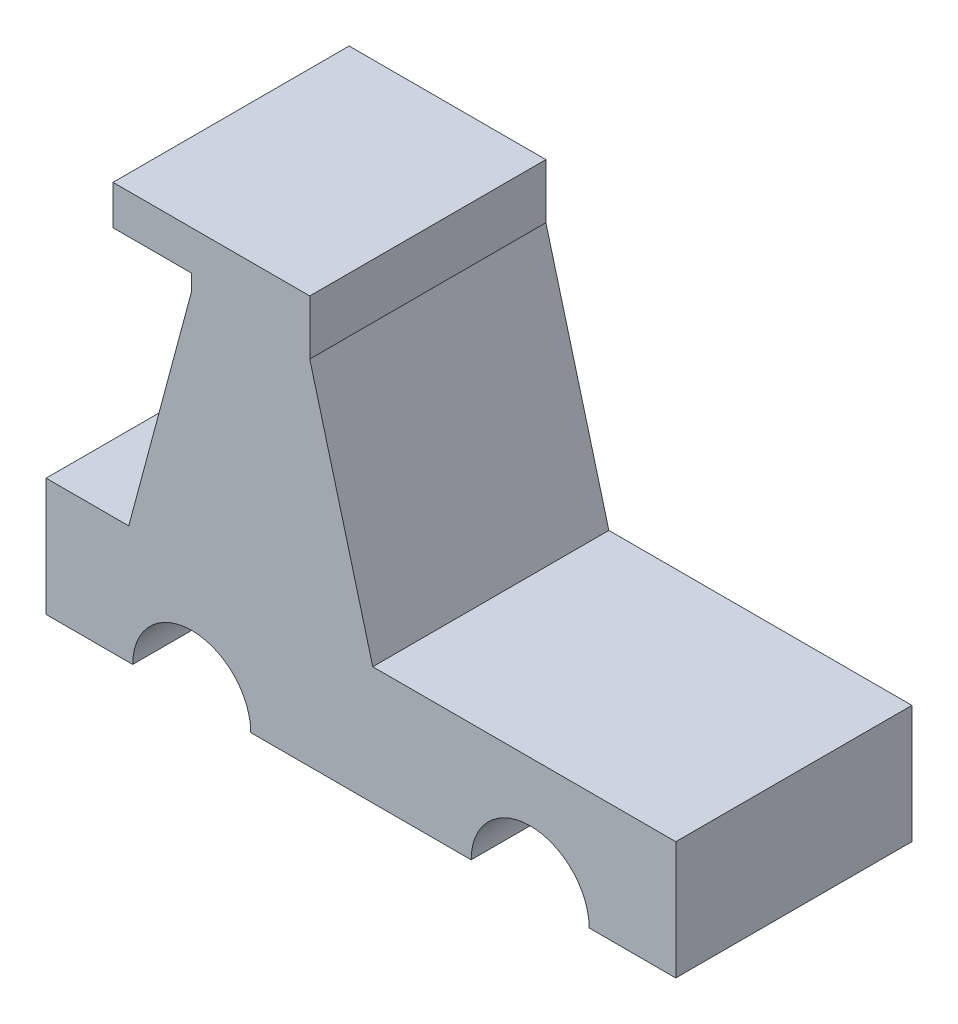
ISO-10303-21;
HEADER;
FILE_DESCRIPTION(('STEP AP214'),'2;1');
FILE_NAME('part.step','',(''),(''),'','','');
FILE_SCHEMA(('AUTOMOTIVE_DESIGN { 1 0 10303 214 1 1 1 1 }'));
ENDSEC;
DATA;
#1=APPLICATION_CONTEXT('core data for automotive mechanical design processes');
#2=APPLICATION_PROTOCOL_DEFINITION('international standard','automotive_design',2000,#1);
#3=PRODUCT_CONTEXT('',#1,'mechanical');
#4=PRODUCT('Part','Part','',(#3));
#5=PRODUCT_RELATED_PRODUCT_CATEGORY('part','',(#4));
#6=PRODUCT_DEFINITION_FORMATION('','',#4);
#7=PRODUCT_DEFINITION_CONTEXT('part definition',#1,'design');
#8=PRODUCT_DEFINITION('design','',#6,#7);
#9=PRODUCT_DEFINITION_SHAPE('','',#8);
#10=(LENGTH_UNIT() NAMED_UNIT(*) SI_UNIT(.MILLI.,.METRE.));
#11=(NAMED_UNIT(*) PLANE_ANGLE_UNIT() SI_UNIT($,.RADIAN.));
#12=(NAMED_UNIT(*) SI_UNIT($,.STERADIAN.) SOLID_ANGLE_UNIT());
#13=UNCERTAINTY_MEASURE_WITH_UNIT(LENGTH_MEASURE(1.E-05),#10,'distance_accuracy_value','');
#14=(GEOMETRIC_REPRESENTATION_CONTEXT(3) GLOBAL_UNCERTAINTY_ASSIGNED_CONTEXT((#13)) GLOBAL_UNIT_ASSIGNED_CONTEXT((#10,
#11,#12)) REPRESENTATION_CONTEXT('',''));
#15=CARTESIAN_POINT('',(0.,0.,0.));
#16=DIRECTION('',(0.,0.,1.));
#17=DIRECTION('',(1.,0.,0.));
#18=AXIS2_PLACEMENT_3D('',#15,#16,#17);
#19=CARTESIAN_POINT('',(0.,30.,0.));
#20=DIRECTION('',(0.,-1.,0.));
#21=DIRECTION('',(0.,0.,-1.));
#22=AXIS2_PLACEMENT_3D('',#19,#20,#21);
#23=PLANE('',#22);
#24=DIRECTION('',(0.,0.,1.));
#25=VECTOR('',#24,1.);
#26=CARTESIAN_POINT('',(10.5,30.,-79.4291412023312));
#27=LINE('',#26,#25);
#28=CARTESIAN_POINT('',(10.5,30.,-30.));
#29=VERTEX_POINT('',#28);
#30=CARTESIAN_POINT('',(10.5,30.,0.));
#31=VERTEX_POINT('',#30);
#32=EDGE_CURVE('E210',#29,#31,#27,.T.);
#33=ORIENTED_EDGE('',*,*,#32,.F.);
#34=DIRECTION('',(-1.,0.,0.));
#35=VECTOR('',#34,1.);
#36=CARTESIAN_POINT('',(0.,30.,-30.));
#37=LINE('',#36,#35);
#38=CARTESIAN_POINT('',(0.,30.,-30.));
#39=VERTEX_POINT('',#38);
#40=EDGE_CURVE('E202',#29,#39,#37,.T.);
#41=ORIENTED_EDGE('',*,*,#40,.T.);
#42=DIRECTION('',(0.,0.,1.));
#43=VECTOR('',#42,1.);
#44=CARTESIAN_POINT('',(0.,30.,0.));
#45=LINE('',#44,#43);
#46=CARTESIAN_POINT('',(0.,30.,0.));
#47=VERTEX_POINT('',#46);
#48=EDGE_CURVE('E190',#39,#47,#45,.T.);
#49=ORIENTED_EDGE('',*,*,#48,.T.);
#50=DIRECTION('',(1.,0.,0.));
#51=VECTOR('',#50,1.);
#52=CARTESIAN_POINT('',(0.,30.,0.));
#53=LINE('',#52,#51);
#54=EDGE_CURVE('E199',#47,#31,#53,.T.);
#55=ORIENTED_EDGE('',*,*,#54,.T.);
#56=EDGE_LOOP('',(#33,#41,#49,#55));
#57=FACE_BOUND('',#56,.T.);
#58=ADVANCED_FACE('F36',(#57),#23,.F.);
#59=CARTESIAN_POINT('',(0.,30.,0.));
#60=DIRECTION('',(1.,0.,0.));
#61=DIRECTION('',(0.,0.,-1.));
#62=AXIS2_PLACEMENT_3D('',#59,#60,#61);
#63=PLANE('',#62);
#64=DIRECTION('',(0.,-1.,0.));
#65=VECTOR('',#64,1.);
#66=CARTESIAN_POINT('',(0.,30.,-30.));
#67=LINE('',#66,#65);
#68=CARTESIAN_POINT('',(0.,15.,-30.));
#69=VERTEX_POINT('',#68);
#70=EDGE_CURVE('E171',#39,#69,#67,.T.);
#71=ORIENTED_EDGE('',*,*,#70,.T.);
#72=DIRECTION('',(0.,0.,1.));
#73=VECTOR('',#72,1.);
#74=CARTESIAN_POINT('',(0.,15.,0.));
#75=LINE('',#74,#73);
#76=CARTESIAN_POINT('',(0.,15.,0.));
#77=VERTEX_POINT('',#76);
#78=EDGE_CURVE('E215',#69,#77,#75,.T.);
#79=ORIENTED_EDGE('',*,*,#78,.T.);
#80=DIRECTION('',(0.,-1.,0.));
#81=VECTOR('',#80,1.);
#82=CARTESIAN_POINT('',(0.,30.,0.));
#83=LINE('',#82,#81);
#84=EDGE_CURVE('E173',#47,#77,#83,.T.);
#85=ORIENTED_EDGE('',*,*,#84,.F.);
#86=ORIENTED_EDGE('',*,*,#48,.F.);
#87=EDGE_LOOP('',(#71,#79,#85,#86));
#88=FACE_BOUND('',#87,.T.);
#89=ADVANCED_FACE('F38',(#88),#63,.F.);
#90=CARTESIAN_POINT('',(0.,30.,0.));
#91=DIRECTION('',(0.,0.,-1.));
#92=DIRECTION('',(-1.,0.,0.));
#93=AXIS2_PLACEMENT_3D('',#90,#91,#92);
#94=PLANE('',#93);
#95=ORIENTED_EDGE('',*,*,#84,.T.);
#96=DIRECTION('',(1.,0.,0.));
#97=VECTOR('',#96,1.);
#98=CARTESIAN_POINT('',(0.,15.,0.));
#99=LINE('',#98,#97);
#100=CARTESIAN_POINT('',(11.,15.,0.));
#101=VERTEX_POINT('',#100);
#102=EDGE_CURVE('E217',#77,#101,#99,.T.);
#103=ORIENTED_EDGE('',*,*,#102,.T.);
#104=CARTESIAN_POINT('',(18.5,15.,0.));
#105=DIRECTION('',(0.,0.,-1.));
#106=DIRECTION('',(-1.,0.,0.));
#107=AXIS2_PLACEMENT_3D('',#104,#105,#106);
#108=CIRCLE('',#107,7.5);
#109=CARTESIAN_POINT('',(26.,15.,0.));
#110=VERTEX_POINT('',#109);
#111=EDGE_CURVE('E191',#101,#110,#108,.T.);
#112=ORIENTED_EDGE('',*,*,#111,.T.);
#113=CARTESIAN_POINT('',(54.,15.,0.));
#114=VERTEX_POINT('',#113);
#115=EDGE_CURVE('E166',#110,#114,#99,.T.);
#116=ORIENTED_EDGE('',*,*,#115,.T.);
#117=CARTESIAN_POINT('',(61.5,15.,0.));
#118=DIRECTION('',(0.,0.,-1.));
#119=DIRECTION('',(-1.,0.,0.));
#120=AXIS2_PLACEMENT_3D('',#117,#118,#119);
#121=CIRCLE('',#120,7.5);
#122=CARTESIAN_POINT('',(69.,15.,0.));
#123=VERTEX_POINT('',#122);
#124=EDGE_CURVE('E184',#114,#123,#121,.T.);
#125=ORIENTED_EDGE('',*,*,#124,.T.);
#126=CARTESIAN_POINT('',(80.,15.,0.));
#127=VERTEX_POINT('',#126);
#128=EDGE_CURVE('E59',#123,#127,#99,.T.);
#129=ORIENTED_EDGE('',*,*,#128,.T.);
#130=DIRECTION('',(0.,-1.,0.));
#131=VECTOR('',#130,1.);
#132=CARTESIAN_POINT('',(80.,30.,0.));
#133=LINE('',#132,#131);
#134=CARTESIAN_POINT('',(80.,30.,0.));
#135=VERTEX_POINT('',#134);
#136=EDGE_CURVE('E165',#135,#127,#133,.T.);
#137=ORIENTED_EDGE('',*,*,#136,.F.);
#138=CARTESIAN_POINT('',(41.5,30.,0.));
#139=VERTEX_POINT('',#138);
#140=EDGE_CURVE('E194',#139,#135,#53,.T.);
#141=ORIENTED_EDGE('',*,*,#140,.F.);
#142=DIRECTION('',(0.258819045102518,-0.965925826289069,0.));
#143=VECTOR('',#142,1.);
#144=CARTESIAN_POINT('',(46.2200271285271,12.3846189432333,0.));
#145=LINE('',#144,#143);
#146=CARTESIAN_POINT('',(33.5,59.8564064605514,0.));
#147=VERTEX_POINT('',#146);
#148=EDGE_CURVE('E248',#147,#139,#145,.T.);
#149=ORIENTED_EDGE('',*,*,#148,.F.);
#150=DIRECTION('',(0.,-1.,0.));
#151=VECTOR('',#150,1.);
#152=CARTESIAN_POINT('',(33.5000000000001,0.,0.));
#153=LINE('',#152,#151);
#154=CARTESIAN_POINT('',(33.5,66.8,0.));
#155=VERTEX_POINT('',#154);
#156=EDGE_CURVE('E251',#155,#147,#153,.T.);
#157=ORIENTED_EDGE('',*,*,#156,.F.);
#158=DIRECTION('',(1.,0.,0.));
#159=VECTOR('',#158,1.);
#160=CARTESIAN_POINT('',(0.,66.8,0.));
#161=LINE('',#160,#159);
#162=CARTESIAN_POINT('',(8.49999999999999,66.8,0.));
#163=VERTEX_POINT('',#162);
#164=EDGE_CURVE('E254',#163,#155,#161,.T.);
#165=ORIENTED_EDGE('',*,*,#164,.F.);
#166=DIRECTION('',(0.,1.,0.));
#167=VECTOR('',#166,1.);
#168=CARTESIAN_POINT('',(8.50000000000009,0.,0.));
#169=LINE('',#168,#167);
#170=CARTESIAN_POINT('',(8.5,61.8,0.));
#171=VERTEX_POINT('',#170);
#172=EDGE_CURVE('E257',#171,#163,#169,.T.);
#173=ORIENTED_EDGE('',*,*,#172,.F.);
#174=DIRECTION('',(1.,0.,0.));
#175=VECTOR('',#174,1.);
#176=CARTESIAN_POINT('',(0.,61.8,0.));
#177=LINE('',#176,#175);
#178=CARTESIAN_POINT('',(18.5,61.8,0.));
#179=VERTEX_POINT('',#178);
#180=EDGE_CURVE('E233',#171,#179,#177,.T.);
#181=ORIENTED_EDGE('',*,*,#180,.T.);
#182=DIRECTION('',(0.,1.,0.));
#183=VECTOR('',#182,1.);
#184=CARTESIAN_POINT('',(18.5,0.,0.));
#185=LINE('',#184,#183);
#186=CARTESIAN_POINT('',(18.5,59.8564064605514,0.));
#187=VERTEX_POINT('',#186);
#188=EDGE_CURVE('E228',#187,#179,#185,.T.);
#189=ORIENTED_EDGE('',*,*,#188,.F.);
#190=DIRECTION('',(0.258819045102518,0.965925826289069,0.));
#191=VECTOR('',#190,1.);
#192=CARTESIAN_POINT('',(2.29663336986839,-0.615381056766597,0.));
#193=LINE('',#192,#191);
#194=EDGE_CURVE('E222',#31,#187,#193,.T.);
#195=ORIENTED_EDGE('',*,*,#194,.F.);
#196=ORIENTED_EDGE('',*,*,#54,.F.);
#197=EDGE_LOOP('',(#95,#103,#112,#116,#125,#129,#137,#141,#149,#157,#165,#173,#181,#189,#195,#196));
#198=FACE_BOUND('',#197,.T.);
#199=ADVANCED_FACE('F188',(#198),#94,.F.);
#200=CARTESIAN_POINT('',(80.,30.,0.));
#201=DIRECTION('',(-1.,0.,0.));
#202=DIRECTION('',(0.,0.,1.));
#203=AXIS2_PLACEMENT_3D('',#200,#201,#202);
#204=PLANE('',#203);
#205=ORIENTED_EDGE('',*,*,#136,.T.);
#206=DIRECTION('',(0.,0.,-1.));
#207=VECTOR('',#206,1.);
#208=CARTESIAN_POINT('',(80.,15.,0.));
#209=LINE('',#208,#207);
#210=CARTESIAN_POINT('',(80.,15.,-30.));
#211=VERTEX_POINT('',#210);
#212=EDGE_CURVE('E150',#127,#211,#209,.T.);
#213=ORIENTED_EDGE('',*,*,#212,.T.);
#214=DIRECTION('',(0.,-1.,0.));
#215=VECTOR('',#214,1.);
#216=CARTESIAN_POINT('',(80.,30.,-30.));
#217=LINE('',#216,#215);
#218=CARTESIAN_POINT('',(80.,30.,-30.));
#219=VERTEX_POINT('',#218);
#220=EDGE_CURVE('E162',#219,#211,#217,.T.);
#221=ORIENTED_EDGE('',*,*,#220,.F.);
#222=DIRECTION('',(0.,0.,-1.));
#223=VECTOR('',#222,1.);
#224=CARTESIAN_POINT('',(80.,30.,0.));
#225=LINE('',#224,#223);
#226=EDGE_CURVE('E201',#135,#219,#225,.T.);
#227=ORIENTED_EDGE('',*,*,#226,.F.);
#228=EDGE_LOOP('',(#205,#213,#221,#227));
#229=FACE_BOUND('',#228,.T.);
#230=ADVANCED_FACE('F160',(#229),#204,.F.);
#231=CARTESIAN_POINT('',(0.,30.,-30.));
#232=DIRECTION('',(0.,0.,1.));
#233=DIRECTION('',(1.,0.,0.));
#234=AXIS2_PLACEMENT_3D('',#231,#232,#233);
#235=PLANE('',#234);
#236=ORIENTED_EDGE('',*,*,#220,.T.);
#237=DIRECTION('',(-1.,0.,0.));
#238=VECTOR('',#237,1.);
#239=CARTESIAN_POINT('',(-10.0991698411264,15.,-30.));
#240=LINE('',#239,#238);
#241=CARTESIAN_POINT('',(69.,15.,-30.));
#242=VERTEX_POINT('',#241);
#243=EDGE_CURVE('E147',#211,#242,#240,.T.);
#244=ORIENTED_EDGE('',*,*,#243,.T.);
#245=CARTESIAN_POINT('',(61.5,15.,-30.));
#246=DIRECTION('',(0.,0.,1.));
#247=DIRECTION('',(1.,0.,0.));
#248=AXIS2_PLACEMENT_3D('',#245,#246,#247);
#249=CIRCLE('',#248,7.5);
#250=CARTESIAN_POINT('',(54.,15.,-30.));
#251=VERTEX_POINT('',#250);
#252=EDGE_CURVE('E185',#242,#251,#249,.T.);
#253=ORIENTED_EDGE('',*,*,#252,.T.);
#254=CARTESIAN_POINT('',(26.,15.,-30.));
#255=VERTEX_POINT('',#254);
#256=EDGE_CURVE('E155',#251,#255,#240,.T.);
#257=ORIENTED_EDGE('',*,*,#256,.T.);
#258=CARTESIAN_POINT('',(18.5,15.,-30.));
#259=DIRECTION('',(0.,0.,1.));
#260=DIRECTION('',(-1.,0.,0.));
#261=AXIS2_PLACEMENT_3D('',#258,#259,#260);
#262=CIRCLE('',#261,7.5);
#263=CARTESIAN_POINT('',(11.,15.,-30.));
#264=VERTEX_POINT('',#263);
#265=EDGE_CURVE('E237',#255,#264,#262,.T.);
#266=ORIENTED_EDGE('',*,*,#265,.T.);
#267=EDGE_CURVE('E51',#264,#69,#240,.T.);
#268=ORIENTED_EDGE('',*,*,#267,.T.);
#269=ORIENTED_EDGE('',*,*,#70,.F.);
#270=ORIENTED_EDGE('',*,*,#40,.F.);
#271=DIRECTION('',(-0.258819045102518,-0.965925826289069,0.));
#272=VECTOR('',#271,1.);
#273=CARTESIAN_POINT('',(2.2966333698684,-0.615381056766596,-30.));
#274=LINE('',#273,#272);
#275=CARTESIAN_POINT('',(18.5,59.8564064605514,-30.));
#276=VERTEX_POINT('',#275);
#277=EDGE_CURVE('E226',#276,#29,#274,.T.);
#278=ORIENTED_EDGE('',*,*,#277,.F.);
#279=DIRECTION('',(0.,-1.,0.));
#280=VECTOR('',#279,1.);
#281=CARTESIAN_POINT('',(18.5,0.,-30.));
#282=LINE('',#281,#280);
#283=CARTESIAN_POINT('',(18.5,61.8,-30.));
#284=VERTEX_POINT('',#283);
#285=EDGE_CURVE('E240',#284,#276,#282,.T.);
#286=ORIENTED_EDGE('',*,*,#285,.F.);
#287=DIRECTION('',(-1.,0.,0.));
#288=VECTOR('',#287,1.);
#289=CARTESIAN_POINT('',(0.,61.8,-30.));
#290=LINE('',#289,#288);
#291=CARTESIAN_POINT('',(8.5,61.8,-30.));
#292=VERTEX_POINT('',#291);
#293=EDGE_CURVE('E243',#284,#292,#290,.T.);
#294=ORIENTED_EDGE('',*,*,#293,.T.);
#295=DIRECTION('',(0.,-1.,0.));
#296=VECTOR('',#295,1.);
#297=CARTESIAN_POINT('',(8.50000000000009,0.,-30.));
#298=LINE('',#297,#296);
#299=CARTESIAN_POINT('',(8.49999999999999,66.8,-30.));
#300=VERTEX_POINT('',#299);
#301=EDGE_CURVE('E456',#300,#292,#298,.T.);
#302=ORIENTED_EDGE('',*,*,#301,.F.);
#303=DIRECTION('',(-1.,0.,0.));
#304=VECTOR('',#303,1.);
#305=CARTESIAN_POINT('',(0.,66.8,-30.));
#306=LINE('',#305,#304);
#307=CARTESIAN_POINT('',(33.5,66.8,-30.));
#308=VERTEX_POINT('',#307);
#309=EDGE_CURVE('E448',#308,#300,#306,.T.);
#310=ORIENTED_EDGE('',*,*,#309,.F.);
#311=DIRECTION('',(0.,1.,0.));
#312=VECTOR('',#311,1.);
#313=CARTESIAN_POINT('',(33.5000000000001,0.,-30.));
#314=LINE('',#313,#312);
#315=CARTESIAN_POINT('',(33.5,59.8564064605514,-30.));
#316=VERTEX_POINT('',#315);
#317=EDGE_CURVE('E458',#316,#308,#314,.T.);
#318=ORIENTED_EDGE('',*,*,#317,.F.);
#319=DIRECTION('',(-0.258819045102518,0.965925826289069,0.));
#320=VECTOR('',#319,1.);
#321=CARTESIAN_POINT('',(46.2200271285271,12.3846189432333,-30.));
#322=LINE('',#321,#320);
#323=CARTESIAN_POINT('',(41.5,30.,-30.));
#324=VERTEX_POINT('',#323);
#325=EDGE_CURVE('E264',#324,#316,#322,.T.);
#326=ORIENTED_EDGE('',*,*,#325,.F.);
#327=EDGE_CURVE('E170',#219,#324,#37,.T.);
#328=ORIENTED_EDGE('',*,*,#327,.F.);
#329=EDGE_LOOP('',(#236,#244,#253,#257,#266,#268,#269,#270,#278,#286,#294,#302,#310,#318,#326,#328));
#330=FACE_BOUND('',#329,.T.);
#331=ADVANCED_FACE('F168',(#330),#235,.F.);
#332=ORIENTED_EDGE('',*,*,#327,.T.);
#333=DIRECTION('',(0.,0.,1.));
#334=VECTOR('',#333,1.);
#335=CARTESIAN_POINT('',(41.5,30.,-79.4291412023312));
#336=LINE('',#335,#334);
#337=EDGE_CURVE('E227',#324,#139,#336,.T.);
#338=ORIENTED_EDGE('',*,*,#337,.T.);
#339=ORIENTED_EDGE('',*,*,#140,.T.);
#340=ORIENTED_EDGE('',*,*,#226,.T.);
#341=EDGE_LOOP('',(#332,#338,#339,#340));
#342=FACE_BOUND('',#341,.T.);
#343=ADVANCED_FACE('F285',(#342),#23,.F.);
#344=CARTESIAN_POINT('',(18.5,15.,-30.));
#345=DIRECTION('',(0.,0.,1.));
#346=DIRECTION('',(1.,0.,0.));
#347=AXIS2_PLACEMENT_3D('',#344,#345,#346);
#348=CYLINDRICAL_SURFACE('',#347,7.5);
#349=ORIENTED_EDGE('',*,*,#111,.F.);
#350=DIRECTION('',(0.,0.,1.));
#351=VECTOR('',#350,1.);
#352=CARTESIAN_POINT('',(11.,15.,-30.));
#353=LINE('',#352,#351);
#354=EDGE_CURVE('E464',#101,#264,#353,.F.);
#355=ORIENTED_EDGE('',*,*,#354,.T.);
#356=ORIENTED_EDGE('',*,*,#265,.F.);
#357=DIRECTION('',(0.,0.,1.));
#358=VECTOR('',#357,1.);
#359=CARTESIAN_POINT('',(26.,15.,-30.));
#360=LINE('',#359,#358);
#361=EDGE_CURVE('E466',#255,#110,#360,.T.);
#362=ORIENTED_EDGE('',*,*,#361,.T.);
#363=EDGE_LOOP('',(#349,#355,#356,#362));
#364=FACE_BOUND('',#363,.T.);
#365=ADVANCED_FACE('F287',(#364),#348,.F.);
#366=CARTESIAN_POINT('',(61.5,15.,-30.));
#367=DIRECTION('',(0.,0.,1.));
#368=DIRECTION('',(1.,0.,0.));
#369=AXIS2_PLACEMENT_3D('',#366,#367,#368);
#370=CYLINDRICAL_SURFACE('',#369,7.5);
#371=ORIENTED_EDGE('',*,*,#124,.F.);
#372=DIRECTION('',(0.,0.,1.));
#373=VECTOR('',#372,1.);
#374=CARTESIAN_POINT('',(54.,15.,-30.));
#375=LINE('',#374,#373);
#376=EDGE_CURVE('E11',#114,#251,#375,.F.);
#377=ORIENTED_EDGE('',*,*,#376,.T.);
#378=ORIENTED_EDGE('',*,*,#252,.F.);
#379=DIRECTION('',(0.,0.,1.));
#380=VECTOR('',#379,1.);
#381=CARTESIAN_POINT('',(69.,15.,-30.));
#382=LINE('',#381,#380);
#383=EDGE_CURVE('E44',#242,#123,#382,.T.);
#384=ORIENTED_EDGE('',*,*,#383,.T.);
#385=EDGE_LOOP('',(#371,#377,#378,#384));
#386=FACE_BOUND('',#385,.T.);
#387=ADVANCED_FACE('F183',(#386),#370,.F.);
#388=CARTESIAN_POINT('',(2.29663336986839,-0.615381056766597,-79.4291412023312));
#389=DIRECTION('',(0.965925826289069,-0.258819045102518,0.));
#390=DIRECTION('',(0.258819045102518,0.965925826289069,0.));
#391=AXIS2_PLACEMENT_3D('',#388,#389,#390);
#392=PLANE('',#391);
#393=DIRECTION('',(0.,0.,1.));
#394=VECTOR('',#393,1.);
#395=CARTESIAN_POINT('',(18.5,59.8564064605514,-79.4291412023312));
#396=LINE('',#395,#394);
#397=EDGE_CURVE('E262',#276,#187,#396,.T.);
#398=ORIENTED_EDGE('',*,*,#397,.F.);
#399=ORIENTED_EDGE('',*,*,#277,.T.);
#400=ORIENTED_EDGE('',*,*,#32,.T.);
#401=ORIENTED_EDGE('',*,*,#194,.T.);
#402=EDGE_LOOP('',(#398,#399,#400,#401));
#403=FACE_BOUND('',#402,.T.);
#404=ADVANCED_FACE('F225',(#403),#392,.F.);
#405=CARTESIAN_POINT('',(18.5,0.,-79.4291412023312));
#406=DIRECTION('',(1.,0.,0.));
#407=DIRECTION('',(0.,0.,-1.));
#408=AXIS2_PLACEMENT_3D('',#405,#406,#407);
#409=PLANE('',#408);
#410=DIRECTION('',(0.,0.,1.));
#411=VECTOR('',#410,1.);
#412=CARTESIAN_POINT('',(18.5,61.8,-79.4291412023312));
#413=LINE('',#412,#411);
#414=EDGE_CURVE('E265',#284,#179,#413,.T.);
#415=ORIENTED_EDGE('',*,*,#414,.F.);
#416=ORIENTED_EDGE('',*,*,#285,.T.);
#417=ORIENTED_EDGE('',*,*,#397,.T.);
#418=ORIENTED_EDGE('',*,*,#188,.T.);
#419=EDGE_LOOP('',(#415,#416,#417,#418));
#420=FACE_BOUND('',#419,.T.);
#421=ADVANCED_FACE('F355',(#420),#409,.F.);
#422=CARTESIAN_POINT('',(0.,61.8,-79.4291412023312));
#423=DIRECTION('',(0.,-1.,0.));
#424=DIRECTION('',(0.,0.,-1.));
#425=AXIS2_PLACEMENT_3D('',#422,#423,#424);
#426=PLANE('',#425);
#427=ORIENTED_EDGE('',*,*,#293,.F.);
#428=ORIENTED_EDGE('',*,*,#414,.T.);
#429=ORIENTED_EDGE('',*,*,#180,.F.);
#430=DIRECTION('',(0.,0.,1.));
#431=VECTOR('',#430,1.);
#432=CARTESIAN_POINT('',(8.5,61.8,-79.4291412023312));
#433=LINE('',#432,#431);
#434=EDGE_CURVE('E267',#292,#171,#433,.T.);
#435=ORIENTED_EDGE('',*,*,#434,.F.);
#436=EDGE_LOOP('',(#427,#428,#429,#435));
#437=FACE_BOUND('',#436,.T.);
#438=ADVANCED_FACE('F358',(#437),#426,.T.);
#439=CARTESIAN_POINT('',(8.50000000000009,0.,-79.4291412023312));
#440=DIRECTION('',(1.,0.,0.));
#441=DIRECTION('',(0.,1.,0.));
#442=AXIS2_PLACEMENT_3D('',#439,#440,#441);
#443=PLANE('',#442);
#444=DIRECTION('',(0.,0.,1.));
#445=VECTOR('',#444,1.);
#446=CARTESIAN_POINT('',(8.49999999999999,66.8,-79.4291412023312));
#447=LINE('',#446,#445);
#448=EDGE_CURVE('E269',#300,#163,#447,.T.);
#449=ORIENTED_EDGE('',*,*,#448,.F.);
#450=ORIENTED_EDGE('',*,*,#301,.T.);
#451=ORIENTED_EDGE('',*,*,#434,.T.);
#452=ORIENTED_EDGE('',*,*,#172,.T.);
#453=EDGE_LOOP('',(#449,#450,#451,#452));
#454=FACE_BOUND('',#453,.T.);
#455=ADVANCED_FACE('F362',(#454),#443,.F.);
#456=CARTESIAN_POINT('',(0.,66.8,-79.4291412023312));
#457=DIRECTION('',(0.,-1.,0.));
#458=DIRECTION('',(0.,0.,-1.));
#459=AXIS2_PLACEMENT_3D('',#456,#457,#458);
#460=PLANE('',#459);
#461=DIRECTION('',(0.,0.,1.));
#462=VECTOR('',#461,1.);
#463=CARTESIAN_POINT('',(33.5,66.8,-79.4291412023312));
#464=LINE('',#463,#462);
#465=EDGE_CURVE('E271',#308,#155,#464,.T.);
#466=ORIENTED_EDGE('',*,*,#465,.F.);
#467=ORIENTED_EDGE('',*,*,#309,.T.);
#468=ORIENTED_EDGE('',*,*,#448,.T.);
#469=ORIENTED_EDGE('',*,*,#164,.T.);
#470=EDGE_LOOP('',(#466,#467,#468,#469));
#471=FACE_BOUND('',#470,.T.);
#472=ADVANCED_FACE('F366',(#471),#460,.F.);
#473=CARTESIAN_POINT('',(33.5000000000001,0.,-79.4291412023312));
#474=DIRECTION('',(-1.,0.,0.));
#475=DIRECTION('',(0.,-1.,0.));
#476=AXIS2_PLACEMENT_3D('',#473,#474,#475);
#477=PLANE('',#476);
#478=DIRECTION('',(0.,0.,1.));
#479=VECTOR('',#478,1.);
#480=CARTESIAN_POINT('',(33.5,59.8564064605514,-79.4291412023312));
#481=LINE('',#480,#479);
#482=EDGE_CURVE('E230',#316,#147,#481,.T.);
#483=ORIENTED_EDGE('',*,*,#482,.F.);
#484=ORIENTED_EDGE('',*,*,#317,.T.);
#485=ORIENTED_EDGE('',*,*,#465,.T.);
#486=ORIENTED_EDGE('',*,*,#156,.T.);
#487=EDGE_LOOP('',(#483,#484,#485,#486));
#488=FACE_BOUND('',#487,.T.);
#489=ADVANCED_FACE('F281',(#488),#477,.F.);
#490=CARTESIAN_POINT('',(46.2200271285271,12.3846189432333,-79.4291412023312));
#491=DIRECTION('',(-0.965925826289069,-0.258819045102518,0.));
#492=DIRECTION('',(0.258819045102518,-0.965925826289069,0.));
#493=AXIS2_PLACEMENT_3D('',#490,#491,#492);
#494=PLANE('',#493);
#495=ORIENTED_EDGE('',*,*,#337,.F.);
#496=ORIENTED_EDGE('',*,*,#325,.T.);
#497=ORIENTED_EDGE('',*,*,#482,.T.);
#498=ORIENTED_EDGE('',*,*,#148,.T.);
#499=EDGE_LOOP('',(#495,#496,#497,#498));
#500=FACE_BOUND('',#499,.T.);
#501=ADVANCED_FACE('F276',(#500),#494,.F.);
#502=CARTESIAN_POINT('',(-10.0991698411264,15.,-30.));
#503=DIRECTION('',(0.,1.,0.));
#504=DIRECTION('',(0.,0.,1.));
#505=AXIS2_PLACEMENT_3D('',#502,#503,#504);
#506=PLANE('',#505);
#507=ORIENTED_EDGE('',*,*,#128,.F.);
#508=ORIENTED_EDGE('',*,*,#383,.F.);
#509=ORIENTED_EDGE('',*,*,#243,.F.);
#510=ORIENTED_EDGE('',*,*,#212,.F.);
#511=EDGE_LOOP('',(#507,#508,#509,#510));
#512=FACE_BOUND('',#511,.T.);
#513=ADVANCED_FACE('F149',(#512),#506,.F.);
#514=ORIENTED_EDGE('',*,*,#256,.F.);
#515=ORIENTED_EDGE('',*,*,#376,.F.);
#516=ORIENTED_EDGE('',*,*,#115,.F.);
#517=ORIENTED_EDGE('',*,*,#361,.F.);
#518=EDGE_LOOP('',(#514,#515,#516,#517));
#519=FACE_BOUND('',#518,.T.);
#520=ADVANCED_FACE('F332',(#519),#506,.F.);
#521=ORIENTED_EDGE('',*,*,#267,.F.);
#522=ORIENTED_EDGE('',*,*,#354,.F.);
#523=ORIENTED_EDGE('',*,*,#102,.F.);
#524=ORIENTED_EDGE('',*,*,#78,.F.);
#525=EDGE_LOOP('',(#521,#522,#523,#524));
#526=FACE_BOUND('',#525,.T.);
#527=ADVANCED_FACE('F334',(#526),#506,.F.);
#528=CLOSED_SHELL('',(#58,#89,#199,#230,#331,#343,#365,#387,#404,#421,#438,#455,#472,#489,#501,
#513,#520,#527));
#529=MANIFOLD_SOLID_BREP('B2',#528);
#530=ADVANCED_BREP_SHAPE_REPRESENTATION('',(#18,#529),#14);
#531=SHAPE_DEFINITION_REPRESENTATION(#9,#530);
ENDSEC;
END-ISO-10303-21;
